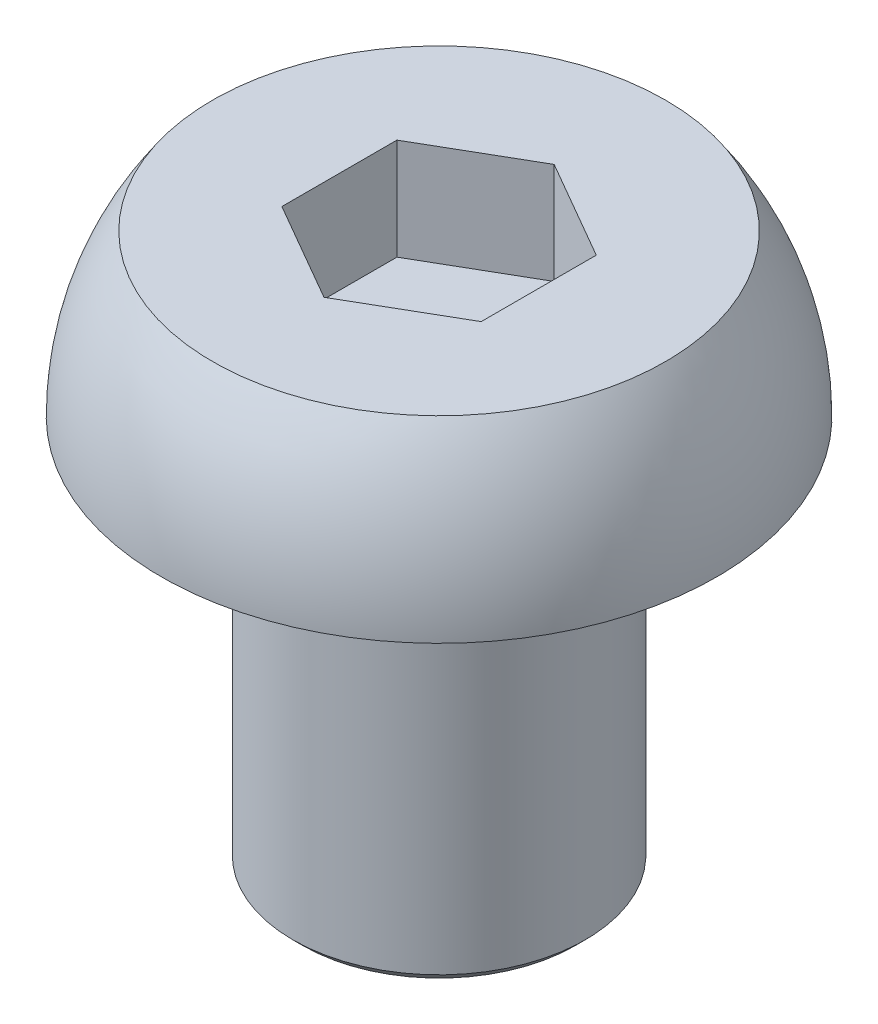
ISO-10303-21;
HEADER;
FILE_DESCRIPTION(('STEP AP214'),'2;1');
FILE_NAME('part.step','',(''),(''),'','','');
FILE_SCHEMA(('AUTOMOTIVE_DESIGN { 1 0 10303 214 1 1 1 1 }'));
ENDSEC;
DATA;
#1=APPLICATION_CONTEXT('core data for automotive mechanical design processes');
#2=APPLICATION_PROTOCOL_DEFINITION('international standard','automotive_design',2000,#1);
#3=PRODUCT_CONTEXT('',#1,'mechanical');
#4=PRODUCT('Part','Part','',(#3));
#5=PRODUCT_RELATED_PRODUCT_CATEGORY('part','',(#4));
#6=PRODUCT_DEFINITION_FORMATION('','',#4);
#7=PRODUCT_DEFINITION_CONTEXT('part definition',#1,'design');
#8=PRODUCT_DEFINITION('design','',#6,#7);
#9=PRODUCT_DEFINITION_SHAPE('','',#8);
#10=(LENGTH_UNIT() NAMED_UNIT(*) SI_UNIT(.MILLI.,.METRE.));
#11=(NAMED_UNIT(*) PLANE_ANGLE_UNIT() SI_UNIT($,.RADIAN.));
#12=(NAMED_UNIT(*) SI_UNIT($,.STERADIAN.) SOLID_ANGLE_UNIT());
#13=UNCERTAINTY_MEASURE_WITH_UNIT(LENGTH_MEASURE(1.E-05),#10,'distance_accuracy_value','');
#14=(GEOMETRIC_REPRESENTATION_CONTEXT(3) GLOBAL_UNCERTAINTY_ASSIGNED_CONTEXT((#13)) GLOBAL_UNIT_ASSIGNED_CONTEXT((#10,
#11,#12)) REPRESENTATION_CONTEXT('',''));
#15=CARTESIAN_POINT('',(0.,0.,0.));
#16=DIRECTION('',(0.,0.,1.));
#17=DIRECTION('',(1.,0.,0.));
#18=AXIS2_PLACEMENT_3D('',#15,#16,#17);
#19=CARTESIAN_POINT('',(0.,0.,0.));
#20=DIRECTION('',(0.,-1.,0.));
#21=DIRECTION('',(0.,0.,-1.));
#22=AXIS2_PLACEMENT_3D('',#19,#20,#21);
#23=PLANE('',#22);
#24=CARTESIAN_POINT('',(0.,0.,0.));
#25=DIRECTION('',(0.,-1.,0.));
#26=DIRECTION('',(0.,0.,-1.));
#27=AXIS2_PLACEMENT_3D('',#24,#25,#26);
#28=CIRCLE('',#27,1.5);
#29=CARTESIAN_POINT('',(0.,0.,-1.5));
#30=VERTEX_POINT('',#29);
#31=EDGE_CURVE('E144',#30,#30,#28,.T.);
#32=ORIENTED_EDGE('',*,*,#31,.F.);
#33=EDGE_LOOP('',(#32));
#34=FACE_BOUND('',#33,.T.);
#35=CARTESIAN_POINT('',(0.,0.,0.));
#36=DIRECTION('',(0.,-1.,0.));
#37=DIRECTION('',(0.,0.,-1.));
#38=AXIS2_PLACEMENT_3D('',#35,#36,#37);
#39=CIRCLE('',#38,2.85);
#40=CARTESIAN_POINT('',(0.,0.,-2.85));
#41=VERTEX_POINT('',#40);
#42=EDGE_CURVE('E147',#41,#41,#39,.T.);
#43=ORIENTED_EDGE('',*,*,#42,.T.);
#44=EDGE_LOOP('',(#43));
#45=FACE_BOUND('',#44,.T.);
#46=ADVANCED_FACE('F36',(#34,#45),#23,.T.);
#47=CARTESIAN_POINT('',(0.,0.,0.));
#48=DIRECTION('',(0.,-1.,0.));
#49=DIRECTION('',(1.,0.,0.));
#50=AXIS2_PLACEMENT_3D('',#47,#48,#49);
#51=SPHERICAL_SURFACE('',#50,2.85);
#52=CARTESIAN_POINT('',(0.,1.65,0.));
#53=DIRECTION('',(0.,-1.,0.));
#54=DIRECTION('',(0.,0.,-1.));
#55=AXIS2_PLACEMENT_3D('',#52,#53,#54);
#56=CIRCLE('',#55,2.32379000772445);
#57=CARTESIAN_POINT('',(0.,1.65,-2.32379000772445));
#58=VERTEX_POINT('',#57);
#59=EDGE_CURVE('E138',#58,#58,#56,.T.);
#60=ORIENTED_EDGE('',*,*,#59,.T.);
#61=EDGE_LOOP('',(#60));
#62=FACE_BOUND('',#61,.T.);
#63=ORIENTED_EDGE('',*,*,#42,.F.);
#64=EDGE_LOOP('',(#63));
#65=FACE_BOUND('',#64,.T.);
#66=ADVANCED_FACE('F165',(#62,#65),#51,.T.);
#67=CARTESIAN_POINT('',(0.,1.65,0.));
#68=DIRECTION('',(0.,1.,0.));
#69=DIRECTION('',(0.,0.,1.));
#70=AXIS2_PLACEMENT_3D('',#67,#68,#69);
#71=PLANE('',#70);
#72=DIRECTION('',(0.866025403784438,0.,-0.5));
#73=VECTOR('',#72,1.);
#74=CARTESIAN_POINT('',(0.,1.65,1.18068130049279));
#75=LINE('',#74,#73);
#76=CARTESIAN_POINT('',(0.,1.65,1.18068130049279));
#77=VERTEX_POINT('',#76);
#78=CARTESIAN_POINT('',(1.0225,1.65,0.590340650246393));
#79=VERTEX_POINT('',#78);
#80=EDGE_CURVE('E51',#77,#79,#75,.T.);
#81=ORIENTED_EDGE('',*,*,#80,.F.);
#82=DIRECTION('',(0.866025403784439,0.,0.5));
#83=VECTOR('',#82,1.);
#84=CARTESIAN_POINT('',(-1.0225,1.65,0.590340650246393));
#85=LINE('',#84,#83);
#86=CARTESIAN_POINT('',(-1.0225,1.65,0.590340650246393));
#87=VERTEX_POINT('',#86);
#88=EDGE_CURVE('E134',#87,#77,#85,.T.);
#89=ORIENTED_EDGE('',*,*,#88,.F.);
#90=DIRECTION('',(0.,0.,1.));
#91=VECTOR('',#90,1.);
#92=CARTESIAN_POINT('',(-1.0225,1.65,-0.590340650246393));
#93=LINE('',#92,#91);
#94=CARTESIAN_POINT('',(-1.0225,1.65,-0.590340650246393));
#95=VERTEX_POINT('',#94);
#96=EDGE_CURVE('E132',#95,#87,#93,.T.);
#97=ORIENTED_EDGE('',*,*,#96,.F.);
#98=DIRECTION('',(-0.866025403784439,0.,0.5));
#99=VECTOR('',#98,1.);
#100=CARTESIAN_POINT('',(0.,1.65,-1.18068130049279));
#101=LINE('',#100,#99);
#102=CARTESIAN_POINT('',(0.,1.65,-1.18068130049279));
#103=VERTEX_POINT('',#102);
#104=EDGE_CURVE('E99',#103,#95,#101,.T.);
#105=ORIENTED_EDGE('',*,*,#104,.F.);
#106=DIRECTION('',(-0.866025403784439,0.,-0.5));
#107=VECTOR('',#106,1.);
#108=CARTESIAN_POINT('',(1.0225,1.65,-0.590340650246393));
#109=LINE('',#108,#107);
#110=CARTESIAN_POINT('',(1.0225,1.65,-0.590340650246393));
#111=VERTEX_POINT('',#110);
#112=EDGE_CURVE('E128',#111,#103,#109,.T.);
#113=ORIENTED_EDGE('',*,*,#112,.F.);
#114=DIRECTION('',(0.,0.,-1.));
#115=VECTOR('',#114,1.);
#116=CARTESIAN_POINT('',(1.0225,1.65,0.590340650246393));
#117=LINE('',#116,#115);
#118=EDGE_CURVE('E125',#79,#111,#117,.T.);
#119=ORIENTED_EDGE('',*,*,#118,.F.);
#120=EDGE_LOOP('',(#81,#89,#97,#105,#113,#119));
#121=FACE_BOUND('',#120,.T.);
#122=ORIENTED_EDGE('',*,*,#59,.F.);
#123=EDGE_LOOP('',(#122));
#124=FACE_BOUND('',#123,.T.);
#125=ADVANCED_FACE('F170',(#121,#124),#71,.T.);
#126=CARTESIAN_POINT('',(0.,-4.,0.));
#127=DIRECTION('',(0.,1.,0.));
#128=DIRECTION('',(0.,0.,1.));
#129=AXIS2_PLACEMENT_3D('',#126,#127,#128);
#130=CYLINDRICAL_SURFACE('',#129,1.5);
#131=CARTESIAN_POINT('',(0.,-3.9,0.));
#132=DIRECTION('',(0.,-1.,0.));
#133=DIRECTION('',(0.,0.,-1.));
#134=AXIS2_PLACEMENT_3D('',#131,#132,#133);
#135=CIRCLE('',#134,1.5);
#136=CARTESIAN_POINT('',(0.,-3.9,1.5));
#137=VERTEX_POINT('',#136);
#138=EDGE_CURVE('E11',#137,#137,#135,.F.);
#139=ORIENTED_EDGE('',*,*,#138,.T.);
#140=EDGE_LOOP('',(#139));
#141=FACE_BOUND('',#140,.T.);
#142=ORIENTED_EDGE('',*,*,#31,.T.);
#143=EDGE_LOOP('',(#142));
#144=FACE_BOUND('',#143,.T.);
#145=ADVANCED_FACE('F178',(#141,#144),#130,.T.);
#146=CARTESIAN_POINT('',(0.,-4.,0.));
#147=DIRECTION('',(0.,-1.,0.));
#148=DIRECTION('',(0.,0.,-1.));
#149=AXIS2_PLACEMENT_3D('',#146,#147,#148);
#150=PLANE('',#149);
#151=CARTESIAN_POINT('',(0.,-4.,0.));
#152=DIRECTION('',(0.,-1.,0.));
#153=DIRECTION('',(0.,0.,-1.));
#154=AXIS2_PLACEMENT_3D('',#151,#152,#153);
#155=CIRCLE('',#154,1.4);
#156=CARTESIAN_POINT('',(0.,-4.,1.4));
#157=VERTEX_POINT('',#156);
#158=EDGE_CURVE('E44',#157,#157,#155,.T.);
#159=ORIENTED_EDGE('',*,*,#158,.T.);
#160=EDGE_LOOP('',(#159));
#161=FACE_BOUND('',#160,.T.);
#162=ADVANCED_FACE('F154',(#161),#150,.T.);
#163=CARTESIAN_POINT('',(0.,0.61,1.18068130049279));
#164=DIRECTION('',(0.5,0.,0.866025403784439));
#165=DIRECTION('',(0.866025403784438,0.,-0.5));
#166=AXIS2_PLACEMENT_3D('',#163,#164,#165);
#167=PLANE('',#166);
#168=ORIENTED_EDGE('',*,*,#80,.T.);
#169=DIRECTION('',(0.,1.,0.));
#170=VECTOR('',#169,1.);
#171=CARTESIAN_POINT('',(1.0225,0.61,0.590340650246393));
#172=LINE('',#171,#170);
#173=CARTESIAN_POINT('',(1.0225,0.61,0.590340650246393));
#174=VERTEX_POINT('',#173);
#175=EDGE_CURVE('E81',#174,#79,#172,.T.);
#176=ORIENTED_EDGE('',*,*,#175,.F.);
#177=DIRECTION('',(0.866025403784438,0.,-0.5));
#178=VECTOR('',#177,1.);
#179=CARTESIAN_POINT('',(0.,0.61,1.18068130049279));
#180=LINE('',#179,#178);
#181=CARTESIAN_POINT('',(0.,0.61,1.18068130049279));
#182=VERTEX_POINT('',#181);
#183=EDGE_CURVE('E136',#182,#174,#180,.T.);
#184=ORIENTED_EDGE('',*,*,#183,.F.);
#185=DIRECTION('',(0.,1.,0.));
#186=VECTOR('',#185,1.);
#187=CARTESIAN_POINT('',(0.,0.61,1.18068130049279));
#188=LINE('',#187,#186);
#189=EDGE_CURVE('E59',#182,#77,#188,.T.);
#190=ORIENTED_EDGE('',*,*,#189,.T.);
#191=EDGE_LOOP('',(#168,#176,#184,#190));
#192=FACE_BOUND('',#191,.T.);
#193=ADVANCED_FACE('F185',(#192),#167,.F.);
#194=CARTESIAN_POINT('',(-1.0225,0.61,0.590340650246393));
#195=DIRECTION('',(-0.5,0.,0.866025403784439));
#196=DIRECTION('',(0.866025403784439,0.,0.5));
#197=AXIS2_PLACEMENT_3D('',#194,#195,#196);
#198=PLANE('',#197);
#199=ORIENTED_EDGE('',*,*,#88,.T.);
#200=ORIENTED_EDGE('',*,*,#189,.F.);
#201=DIRECTION('',(0.866025403784439,0.,0.5));
#202=VECTOR('',#201,1.);
#203=CARTESIAN_POINT('',(-1.0225,0.61,0.590340650246393));
#204=LINE('',#203,#202);
#205=CARTESIAN_POINT('',(-1.0225,0.61,0.590340650246393));
#206=VERTEX_POINT('',#205);
#207=EDGE_CURVE('E111',#206,#182,#204,.T.);
#208=ORIENTED_EDGE('',*,*,#207,.F.);
#209=DIRECTION('',(0.,1.,0.));
#210=VECTOR('',#209,1.);
#211=CARTESIAN_POINT('',(-1.0225,0.61,0.590340650246393));
#212=LINE('',#211,#210);
#213=EDGE_CURVE('E103',#206,#87,#212,.T.);
#214=ORIENTED_EDGE('',*,*,#213,.T.);
#215=EDGE_LOOP('',(#199,#200,#208,#214));
#216=FACE_BOUND('',#215,.T.);
#217=ADVANCED_FACE('F188',(#216),#198,.F.);
#218=CARTESIAN_POINT('',(-1.0225,0.61,-0.590340650246393));
#219=DIRECTION('',(-1.,0.,0.));
#220=DIRECTION('',(0.,0.,1.));
#221=AXIS2_PLACEMENT_3D('',#218,#219,#220);
#222=PLANE('',#221);
#223=ORIENTED_EDGE('',*,*,#96,.T.);
#224=ORIENTED_EDGE('',*,*,#213,.F.);
#225=DIRECTION('',(0.,0.,1.));
#226=VECTOR('',#225,1.);
#227=CARTESIAN_POINT('',(-1.0225,0.61,-0.590340650246393));
#228=LINE('',#227,#226);
#229=CARTESIAN_POINT('',(-1.0225,0.61,-0.590340650246393));
#230=VERTEX_POINT('',#229);
#231=EDGE_CURVE('E107',#230,#206,#228,.T.);
#232=ORIENTED_EDGE('',*,*,#231,.F.);
#233=DIRECTION('',(0.,1.,0.));
#234=VECTOR('',#233,1.);
#235=CARTESIAN_POINT('',(-1.0225,0.61,-0.590340650246393));
#236=LINE('',#235,#234);
#237=EDGE_CURVE('E92',#230,#95,#236,.T.);
#238=ORIENTED_EDGE('',*,*,#237,.T.);
#239=EDGE_LOOP('',(#223,#224,#232,#238));
#240=FACE_BOUND('',#239,.T.);
#241=ADVANCED_FACE('F108',(#240),#222,.F.);
#242=CARTESIAN_POINT('',(0.,0.61,-1.18068130049279));
#243=DIRECTION('',(-0.5,0.,-0.866025403784439));
#244=DIRECTION('',(-0.866025403784439,0.,0.5));
#245=AXIS2_PLACEMENT_3D('',#242,#243,#244);
#246=PLANE('',#245);
#247=ORIENTED_EDGE('',*,*,#104,.T.);
#248=ORIENTED_EDGE('',*,*,#237,.F.);
#249=DIRECTION('',(-0.866025403784439,0.,0.5));
#250=VECTOR('',#249,1.);
#251=CARTESIAN_POINT('',(0.,0.61,-1.18068130049279));
#252=LINE('',#251,#250);
#253=CARTESIAN_POINT('',(0.,0.61,-1.18068130049279));
#254=VERTEX_POINT('',#253);
#255=EDGE_CURVE('E96',#254,#230,#252,.T.);
#256=ORIENTED_EDGE('',*,*,#255,.F.);
#257=DIRECTION('',(0.,1.,0.));
#258=VECTOR('',#257,1.);
#259=CARTESIAN_POINT('',(0.,0.61,-1.18068130049279));
#260=LINE('',#259,#258);
#261=EDGE_CURVE('E104',#254,#103,#260,.T.);
#262=ORIENTED_EDGE('',*,*,#261,.T.);
#263=EDGE_LOOP('',(#247,#248,#256,#262));
#264=FACE_BOUND('',#263,.T.);
#265=ADVANCED_FACE('F94',(#264),#246,.F.);
#266=CARTESIAN_POINT('',(1.0225,0.61,-0.590340650246393));
#267=DIRECTION('',(0.5,0.,-0.866025403784439));
#268=DIRECTION('',(-0.866025403784439,0.,-0.5));
#269=AXIS2_PLACEMENT_3D('',#266,#267,#268);
#270=PLANE('',#269);
#271=ORIENTED_EDGE('',*,*,#112,.T.);
#272=ORIENTED_EDGE('',*,*,#261,.F.);
#273=DIRECTION('',(-0.866025403784439,0.,-0.5));
#274=VECTOR('',#273,1.);
#275=CARTESIAN_POINT('',(1.0225,0.61,-0.590340650246393));
#276=LINE('',#275,#274);
#277=CARTESIAN_POINT('',(1.0225,0.61,-0.590340650246393));
#278=VERTEX_POINT('',#277);
#279=EDGE_CURVE('E117',#278,#254,#276,.T.);
#280=ORIENTED_EDGE('',*,*,#279,.F.);
#281=DIRECTION('',(0.,1.,0.));
#282=VECTOR('',#281,1.);
#283=CARTESIAN_POINT('',(1.0225,0.61,-0.590340650246393));
#284=LINE('',#283,#282);
#285=EDGE_CURVE('E141',#278,#111,#284,.T.);
#286=ORIENTED_EDGE('',*,*,#285,.T.);
#287=EDGE_LOOP('',(#271,#272,#280,#286));
#288=FACE_BOUND('',#287,.T.);
#289=ADVANCED_FACE('F191',(#288),#270,.F.);
#290=CARTESIAN_POINT('',(1.0225,0.61,0.590340650246393));
#291=DIRECTION('',(1.,0.,0.));
#292=DIRECTION('',(0.,0.,-1.));
#293=AXIS2_PLACEMENT_3D('',#290,#291,#292);
#294=PLANE('',#293);
#295=ORIENTED_EDGE('',*,*,#118,.T.);
#296=ORIENTED_EDGE('',*,*,#285,.F.);
#297=DIRECTION('',(0.,0.,-1.));
#298=VECTOR('',#297,1.);
#299=CARTESIAN_POINT('',(1.0225,0.61,0.590340650246393));
#300=LINE('',#299,#298);
#301=EDGE_CURVE('E119',#174,#278,#300,.T.);
#302=ORIENTED_EDGE('',*,*,#301,.F.);
#303=ORIENTED_EDGE('',*,*,#175,.T.);
#304=EDGE_LOOP('',(#295,#296,#302,#303));
#305=FACE_BOUND('',#304,.T.);
#306=ADVANCED_FACE('F161',(#305),#294,.F.);
#307=CARTESIAN_POINT('',(0.,0.61,0.));
#308=DIRECTION('',(0.,1.,0.));
#309=DIRECTION('',(0.,0.,1.));
#310=AXIS2_PLACEMENT_3D('',#307,#308,#309);
#311=PLANE('',#310);
#312=ORIENTED_EDGE('',*,*,#183,.T.);
#313=ORIENTED_EDGE('',*,*,#301,.T.);
#314=ORIENTED_EDGE('',*,*,#279,.T.);
#315=ORIENTED_EDGE('',*,*,#255,.T.);
#316=ORIENTED_EDGE('',*,*,#231,.T.);
#317=ORIENTED_EDGE('',*,*,#207,.T.);
#318=EDGE_LOOP('',(#312,#313,#314,#315,#316,#317));
#319=FACE_BOUND('',#318,.T.);
#320=ADVANCED_FACE('F114',(#319),#311,.T.);
#321=CARTESIAN_POINT('',(0.,-4.,0.));
#322=DIRECTION('',(0.,1.,0.));
#323=DIRECTION('',(0.,0.,1.));
#324=AXIS2_PLACEMENT_3D('',#321,#322,#323);
#325=CONICAL_SURFACE('',#324,1.4,0.785398163397446);
#326=CARTESIAN_POINT('',(0.,-3.9,1.5));
#327=CARTESIAN_POINT('',(0.,-3.90104166666667,1.49895833333333));
#328=CARTESIAN_POINT('',(0.,-3.90208333333333,1.49791666666667));
#329=CARTESIAN_POINT('',(0.,-3.90416666666667,1.49583333333333));
#330=CARTESIAN_POINT('',(0.,-3.90520833333333,1.49479166666667));
#331=CARTESIAN_POINT('',(0.,-3.90729166666667,1.49270833333333));
#332=CARTESIAN_POINT('',(0.,-3.90833333333333,1.49166666666667));
#333=CARTESIAN_POINT('',(0.,-3.91041666666667,1.48958333333333));
#334=CARTESIAN_POINT('',(0.,-3.91145833333333,1.48854166666667));
#335=CARTESIAN_POINT('',(0.,-3.91354166666667,1.48645833333333));
#336=CARTESIAN_POINT('',(0.,-3.91458333333333,1.48541666666667));
#337=CARTESIAN_POINT('',(0.,-3.91666666666667,1.48333333333333));
#338=CARTESIAN_POINT('',(0.,-3.91770833333333,1.48229166666667));
#339=CARTESIAN_POINT('',(0.,-3.91979166666667,1.48020833333333));
#340=CARTESIAN_POINT('',(0.,-3.92083333333333,1.47916666666667));
#341=CARTESIAN_POINT('',(0.,-3.92291666666667,1.47708333333333));
#342=CARTESIAN_POINT('',(0.,-3.92395833333333,1.47604166666667));
#343=CARTESIAN_POINT('',(0.,-3.92604166666667,1.47395833333333));
#344=CARTESIAN_POINT('',(0.,-3.92708333333333,1.47291666666667));
#345=CARTESIAN_POINT('',(0.,-3.92916666666667,1.47083333333333));
#346=CARTESIAN_POINT('',(0.,-3.93020833333333,1.46979166666667));
#347=CARTESIAN_POINT('',(0.,-3.93229166666667,1.46770833333333));
#348=CARTESIAN_POINT('',(0.,-3.93333333333333,1.46666666666667));
#349=CARTESIAN_POINT('',(0.,-3.93541666666667,1.46458333333333));
#350=CARTESIAN_POINT('',(0.,-3.93645833333333,1.46354166666667));
#351=CARTESIAN_POINT('',(0.,-3.93854166666667,1.46145833333333));
#352=CARTESIAN_POINT('',(0.,-3.93958333333333,1.46041666666667));
#353=CARTESIAN_POINT('',(0.,-3.94166666666667,1.45833333333333));
#354=CARTESIAN_POINT('',(0.,-3.94270833333333,1.45729166666667));
#355=CARTESIAN_POINT('',(0.,-3.94479166666667,1.45520833333333));
#356=CARTESIAN_POINT('',(0.,-3.94583333333333,1.45416666666667));
#357=CARTESIAN_POINT('',(0.,-3.94791666666667,1.45208333333333));
#358=CARTESIAN_POINT('',(0.,-3.94895833333333,1.45104166666667));
#359=CARTESIAN_POINT('',(0.,-3.95104166666667,1.44895833333333));
#360=CARTESIAN_POINT('',(0.,-3.95208333333333,1.44791666666667));
#361=CARTESIAN_POINT('',(0.,-3.95416666666667,1.44583333333333));
#362=CARTESIAN_POINT('',(0.,-3.95520833333333,1.44479166666667));
#363=CARTESIAN_POINT('',(0.,-3.95729166666667,1.44270833333333));
#364=CARTESIAN_POINT('',(0.,-3.95833333333333,1.44166666666667));
#365=CARTESIAN_POINT('',(0.,-3.96041666666667,1.43958333333333));
#366=CARTESIAN_POINT('',(0.,-3.96145833333333,1.43854166666667));
#367=CARTESIAN_POINT('',(0.,-3.96354166666667,1.43645833333333));
#368=CARTESIAN_POINT('',(0.,-3.96458333333333,1.43541666666667));
#369=CARTESIAN_POINT('',(0.,-3.96666666666667,1.43333333333333));
#370=CARTESIAN_POINT('',(0.,-3.96770833333333,1.43229166666667));
#371=CARTESIAN_POINT('',(0.,-3.96979166666667,1.43020833333333));
#372=CARTESIAN_POINT('',(0.,-3.97083333333333,1.42916666666667));
#373=CARTESIAN_POINT('',(0.,-3.97291666666667,1.42708333333333));
#374=CARTESIAN_POINT('',(0.,-3.97395833333333,1.42604166666667));
#375=CARTESIAN_POINT('',(0.,-3.97604166666667,1.42395833333333));
#376=CARTESIAN_POINT('',(0.,-3.97708333333333,1.42291666666667));
#377=CARTESIAN_POINT('',(0.,-3.97916666666667,1.42083333333333));
#378=CARTESIAN_POINT('',(0.,-3.98020833333333,1.41979166666667));
#379=CARTESIAN_POINT('',(0.,-3.98229166666667,1.41770833333333));
#380=CARTESIAN_POINT('',(0.,-3.98333333333333,1.41666666666667));
#381=CARTESIAN_POINT('',(0.,-3.98541666666667,1.41458333333333));
#382=CARTESIAN_POINT('',(0.,-3.98645833333333,1.41354166666667));
#383=CARTESIAN_POINT('',(0.,-3.98854166666667,1.41145833333333));
#384=CARTESIAN_POINT('',(0.,-3.98958333333333,1.41041666666667));
#385=CARTESIAN_POINT('',(0.,-3.99166666666667,1.40833333333333));
#386=CARTESIAN_POINT('',(0.,-3.99270833333333,1.40729166666667));
#387=CARTESIAN_POINT('',(0.,-3.99479166666667,1.40520833333333));
#388=CARTESIAN_POINT('',(0.,-3.99583333333333,1.40416666666667));
#389=CARTESIAN_POINT('',(0.,-3.99791666666667,1.40208333333333));
#390=CARTESIAN_POINT('',(0.,-3.99895833333333,1.40104166666667));
#391=CARTESIAN_POINT('',(0.,-4.,1.4));
#392=B_SPLINE_CURVE_WITH_KNOTS('',3,(#326,#327,#328,#329,#330,#331,#332,#333,#334,#335,#336,
#337,#338,#339,#340,#341,#342,#343,#344,#345,#346,#347,#348,#349,#350,#351,#352,#353,#354,#355,
#356,#357,#358,#359,#360,#361,#362,#363,#364,#365,#366,#367,#368,#369,#370,#371,#372,#373,#374,
#375,#376,#377,#378,#379,#380,#381,#382,#383,#384,#385,#386,#387,#388,#389,#390,#391),
.UNSPECIFIED.,.F.,.F.,(4,2,2,2,2,2,2,2,2,2,2,2,2,2,2,2,2,2,2,2,2,2,2,2,2,2,2,2,2,2,2,2,4),(0.,
0.00441941738241574,0.00883883476483164,0.0132582521472472,0.0176776695296636,
0.0220970869120792,0.0265165042944955,0.0309359216769111,0.0353553390593269,0.0397747564417431,
0.0441941738241588,0.0486135912065744,0.0530330085889907,0.0574524259714063,0.0618718433538227,
0.0662912607362383,0.070710678118654,0.0751300955010702,0.0795495128834858,0.0839689302659021,
0.0883883476483177,0.0928077650307335,0.0972271824131497,0.101646599795565,0.106066017177981,
0.110485434560397,0.114904851942813,0.119324269325229,0.123743686707645,0.128163104090061,
0.132582521472477,0.137001938854893,0.141421356237309),.UNSPECIFIED.);
#393=EDGE_CURVE('BSEAM38',#137,#157,#392,.T.);
#394=ORIENTED_EDGE('',*,*,#138,.F.);
#395=ORIENTED_EDGE('',*,*,#158,.F.);
#396=ORIENTED_EDGE('',*,*,#393,.T.);
#397=ORIENTED_EDGE('',*,*,#393,.F.);
#398=EDGE_LOOP('',(#394,#396,#395,#397));
#399=FACE_BOUND('',#398,.T.);
#400=ADVANCED_FACE('F38',(#399),#325,.T.);
#401=CLOSED_SHELL('',(#46,#66,#125,#145,#162,#193,#217,#241,#265,#289,#306,#320,#400));
#402=MANIFOLD_SOLID_BREP('B2',#401);
#403=ADVANCED_BREP_SHAPE_REPRESENTATION('',(#18,#402),#14);
#404=SHAPE_DEFINITION_REPRESENTATION(#9,#403);
ENDSEC;
END-ISO-10303-21;
